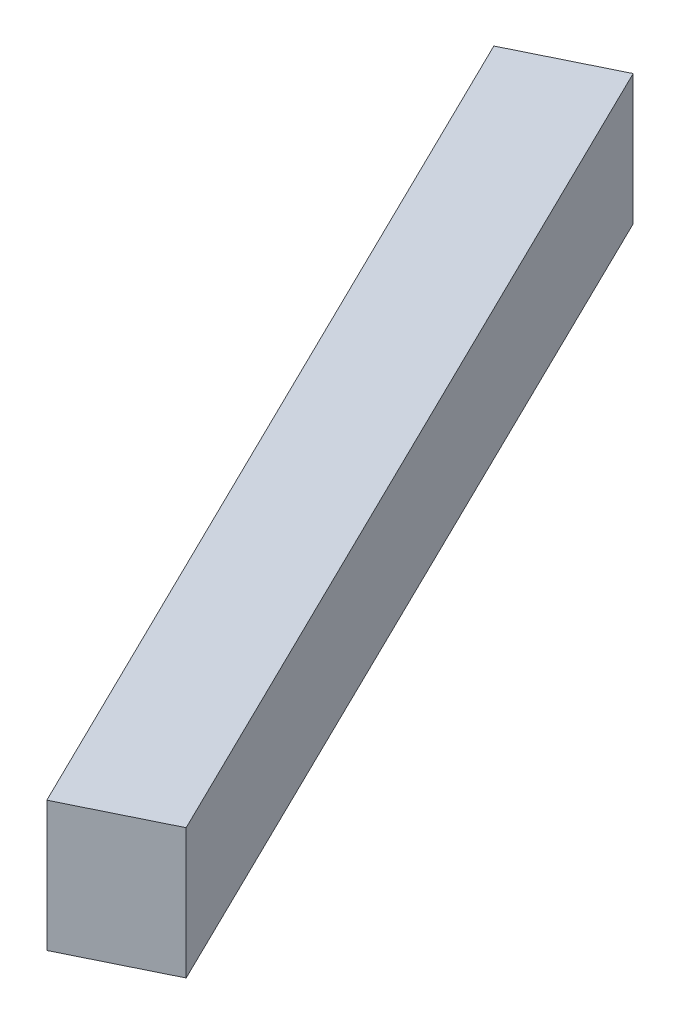
ISO-10303-21;
HEADER;
FILE_DESCRIPTION(('STEP AP214'),'2;1');
FILE_NAME('part.step','',(''),(''),'','','');
FILE_SCHEMA(('AUTOMOTIVE_DESIGN { 1 0 10303 214 1 1 1 1 }'));
ENDSEC;
DATA;
#1=APPLICATION_CONTEXT('core data for automotive mechanical design processes');
#2=APPLICATION_PROTOCOL_DEFINITION('international standard','automotive_design',2000,#1);
#3=PRODUCT_CONTEXT('',#1,'mechanical');
#4=PRODUCT('Part','Part','',(#3));
#5=PRODUCT_RELATED_PRODUCT_CATEGORY('part','',(#4));
#6=PRODUCT_DEFINITION_FORMATION('','',#4);
#7=PRODUCT_DEFINITION_CONTEXT('part definition',#1,'design');
#8=PRODUCT_DEFINITION('design','',#6,#7);
#9=PRODUCT_DEFINITION_SHAPE('','',#8);
#10=(LENGTH_UNIT() NAMED_UNIT(*) SI_UNIT(.MILLI.,.METRE.));
#11=(NAMED_UNIT(*) PLANE_ANGLE_UNIT() SI_UNIT($,.RADIAN.));
#12=(NAMED_UNIT(*) SI_UNIT($,.STERADIAN.) SOLID_ANGLE_UNIT());
#13=UNCERTAINTY_MEASURE_WITH_UNIT(LENGTH_MEASURE(1.E-05),#10,'distance_accuracy_value','');
#14=(GEOMETRIC_REPRESENTATION_CONTEXT(3) GLOBAL_UNCERTAINTY_ASSIGNED_CONTEXT((#13)) GLOBAL_UNIT_ASSIGNED_CONTEXT((#10,
#11,#12)) REPRESENTATION_CONTEXT('',''));
#15=CARTESIAN_POINT('',(0.,0.,0.));
#16=DIRECTION('',(0.,0.,1.));
#17=DIRECTION('',(1.,0.,0.));
#18=AXIS2_PLACEMENT_3D('',#15,#16,#17);
#19=CARTESIAN_POINT('',(-8.00969691536808,7.874,-16.1162711228147));
#20=DIRECTION('',(0.89796613991064,0.,-0.440064553871345));
#21=DIRECTION('',(-0.440064553871345,0.,-0.89796613991064));
#22=AXIS2_PLACEMENT_3D('',#19,#20,#21);
#23=PLANE('',#22);
#24=DIRECTION('',(0.,1.,0.));
#25=VECTOR('',#24,1.);
#26=CARTESIAN_POINT('',(-8.00969691536808,7.874,-16.1162711228147));
#27=LINE('',#26,#25);
#28=CARTESIAN_POINT('',(-8.00969691536808,7.62,-16.1162711228147));
#29=VERTEX_POINT('',#28);
#30=CARTESIAN_POINT('',(-8.00969691536808,7.874,-16.1162711228147));
#31=VERTEX_POINT('',#30);
#32=EDGE_CURVE('E20',#29,#31,#27,.T.);
#33=ORIENTED_EDGE('',*,*,#32,.T.);
#34=DIRECTION('',(-0.440064553871358,0.,-0.897966139910633));
#35=VECTOR('',#34,1.);
#36=CARTESIAN_POINT('',(-8.00969691536808,7.874,-16.1162711228147));
#37=LINE('',#36,#35);
#38=CARTESIAN_POINT('',(-8.84801989049298,7.874,-17.8268966193444));
#39=VERTEX_POINT('',#38);
#40=EDGE_CURVE('E55',#31,#39,#37,.T.);
#41=ORIENTED_EDGE('',*,*,#40,.T.);
#42=DIRECTION('',(0.,1.,0.));
#43=VECTOR('',#42,1.);
#44=CARTESIAN_POINT('',(-8.84801989049299,7.874,-17.8268966193444));
#45=LINE('',#44,#43);
#46=CARTESIAN_POINT('',(-8.84801989049298,7.62,-17.8268966193444));
#47=VERTEX_POINT('',#46);
#48=EDGE_CURVE('E76',#39,#47,#45,.F.);
#49=ORIENTED_EDGE('',*,*,#48,.T.);
#50=DIRECTION('',(-0.440064553871358,0.,-0.897966139910633));
#51=VECTOR('',#50,1.);
#52=CARTESIAN_POINT('',(-8.00969691536808,7.62,-16.1162711228147));
#53=LINE('',#52,#51);
#54=EDGE_CURVE('E58',#29,#47,#53,.T.);
#55=ORIENTED_EDGE('',*,*,#54,.F.);
#56=EDGE_LOOP('',(#33,#41,#49,#55));
#57=FACE_BOUND('',#56,.T.);
#58=ADVANCED_FACE('F17',(#57),#23,.F.);
#59=CARTESIAN_POINT('',(-8.00969691536808,7.874,-16.1162711228147));
#60=DIRECTION('',(-0.440064553871331,0.,-0.897966139910646));
#61=DIRECTION('',(-0.897966139910646,0.,0.440064553871331));
#62=AXIS2_PLACEMENT_3D('',#59,#60,#61);
#63=PLANE('',#62);
#64=DIRECTION('',(0.,1.,0.));
#65=VECTOR('',#64,1.);
#66=CARTESIAN_POINT('',(-7.82723019573824,7.874,-16.2056922401613));
#67=LINE('',#66,#65);
#68=CARTESIAN_POINT('',(-7.82723019573825,7.62,-16.2056922401613));
#69=VERTEX_POINT('',#68);
#70=CARTESIAN_POINT('',(-7.82723019573825,7.874,-16.2056922401613));
#71=VERTEX_POINT('',#70);
#72=EDGE_CURVE('E73',#69,#71,#67,.T.);
#73=ORIENTED_EDGE('',*,*,#72,.T.);
#74=DIRECTION('',(-0.897966139910747,0.,0.440064553871124));
#75=VECTOR('',#74,1.);
#76=CARTESIAN_POINT('',(-7.82723019573824,7.874,-16.2056922401613));
#77=LINE('',#76,#75);
#78=EDGE_CURVE('E63',#71,#31,#77,.T.);
#79=ORIENTED_EDGE('',*,*,#78,.T.);
#80=ORIENTED_EDGE('',*,*,#32,.F.);
#81=DIRECTION('',(-0.897966139910747,0.,0.440064553871124));
#82=VECTOR('',#81,1.);
#83=CARTESIAN_POINT('',(-7.82723019573824,7.62,-16.2056922401613));
#84=LINE('',#83,#82);
#85=EDGE_CURVE('E80',#69,#29,#84,.T.);
#86=ORIENTED_EDGE('',*,*,#85,.F.);
#87=EDGE_LOOP('',(#73,#79,#80,#86));
#88=FACE_BOUND('',#87,.T.);
#89=ADVANCED_FACE('F72',(#88),#63,.F.);
#90=CARTESIAN_POINT('',(-8.00969691536808,7.874,-16.1162711228147));
#91=DIRECTION('',(0.,-1.,0.));
#92=DIRECTION('',(0.,0.,-1.));
#93=AXIS2_PLACEMENT_3D('',#90,#91,#92);
#94=PLANE('',#93);
#95=ORIENTED_EDGE('',*,*,#78,.F.);
#96=DIRECTION('',(0.440064553871658,0.,0.897966139910486));
#97=VECTOR('',#96,1.);
#98=CARTESIAN_POINT('',(-7.82723019573824,7.874,-16.2056922401613));
#99=LINE('',#98,#97);
#100=CARTESIAN_POINT('',(-8.66555317099996,7.874,-17.9163177369687));
#101=VERTEX_POINT('',#100);
#102=EDGE_CURVE('E83',#71,#101,#99,.F.);
#103=ORIENTED_EDGE('',*,*,#102,.T.);
#104=DIRECTION('',(0.897966139240311,0.,-0.440064555239173));
#105=VECTOR('',#104,1.);
#106=CARTESIAN_POINT('',(-8.84801989049299,7.874,-17.8268966193444));
#107=LINE('',#106,#105);
#108=EDGE_CURVE('E69',#101,#39,#107,.F.);
#109=ORIENTED_EDGE('',*,*,#108,.T.);
#110=ORIENTED_EDGE('',*,*,#40,.F.);
#111=EDGE_LOOP('',(#95,#103,#109,#110));
#112=FACE_BOUND('',#111,.T.);
#113=ADVANCED_FACE('F66',(#112),#94,.F.);
#114=CARTESIAN_POINT('',(-8.84801989049299,7.874,-17.8268966193444));
#115=DIRECTION('',(0.440064555239173,0.,0.897966139240311));
#116=DIRECTION('',(0.897966139240311,0.,-0.440064555239173));
#117=AXIS2_PLACEMENT_3D('',#114,#115,#116);
#118=PLANE('',#117);
#119=ORIENTED_EDGE('',*,*,#48,.F.);
#120=ORIENTED_EDGE('',*,*,#108,.F.);
#121=DIRECTION('',(0.,1.,0.));
#122=VECTOR('',#121,1.);
#123=CARTESIAN_POINT('',(-8.66555317099995,7.874,-17.9163177369687));
#124=LINE('',#123,#122);
#125=CARTESIAN_POINT('',(-8.66555317099996,7.62,-17.9163177369687));
#126=VERTEX_POINT('',#125);
#127=EDGE_CURVE('E26',#101,#126,#124,.F.);
#128=ORIENTED_EDGE('',*,*,#127,.T.);
#129=DIRECTION('',(0.897966139240318,0.,-0.440064555239159));
#130=VECTOR('',#129,1.);
#131=CARTESIAN_POINT('',(-8.84801989049299,7.62,-17.8268966193444));
#132=LINE('',#131,#130);
#133=EDGE_CURVE('E34',#47,#126,#132,.T.);
#134=ORIENTED_EDGE('',*,*,#133,.F.);
#135=EDGE_LOOP('',(#119,#120,#128,#134));
#136=FACE_BOUND('',#135,.T.);
#137=ADVANCED_FACE('F88',(#136),#118,.F.);
#138=CARTESIAN_POINT('',(-8.00969691536808,7.62,-16.1162711228147));
#139=DIRECTION('',(0.,-1.,0.));
#140=DIRECTION('',(0.,0.,-1.));
#141=AXIS2_PLACEMENT_3D('',#138,#139,#140);
#142=PLANE('',#141);
#143=DIRECTION('',(0.440064553871658,0.,0.897966139910486));
#144=VECTOR('',#143,1.);
#145=CARTESIAN_POINT('',(-7.82723019573824,7.62,-16.2056922401613));
#146=LINE('',#145,#144);
#147=EDGE_CURVE('E11',#126,#69,#146,.T.);
#148=ORIENTED_EDGE('',*,*,#147,.T.);
#149=ORIENTED_EDGE('',*,*,#85,.T.);
#150=ORIENTED_EDGE('',*,*,#54,.T.);
#151=ORIENTED_EDGE('',*,*,#133,.T.);
#152=EDGE_LOOP('',(#148,#149,#150,#151));
#153=FACE_BOUND('',#152,.T.);
#154=ADVANCED_FACE('F91',(#153),#142,.T.);
#155=CARTESIAN_POINT('',(-7.82723019573824,7.874,-16.2056922401613));
#156=DIRECTION('',(-0.897966139910486,0.,0.440064553871658));
#157=DIRECTION('',(0.440064553871658,0.,0.897966139910486));
#158=AXIS2_PLACEMENT_3D('',#155,#156,#157);
#159=PLANE('',#158);
#160=ORIENTED_EDGE('',*,*,#127,.F.);
#161=ORIENTED_EDGE('',*,*,#102,.F.);
#162=ORIENTED_EDGE('',*,*,#72,.F.);
#163=ORIENTED_EDGE('',*,*,#147,.F.);
#164=EDGE_LOOP('',(#160,#161,#162,#163));
#165=FACE_BOUND('',#164,.T.);
#166=ADVANCED_FACE('F90',(#165),#159,.F.);
#167=CLOSED_SHELL('',(#58,#89,#113,#137,#154,#166));
#168=MANIFOLD_SOLID_BREP('B1',#167);
#169=ADVANCED_BREP_SHAPE_REPRESENTATION('',(#18,#168),#14);
#170=SHAPE_DEFINITION_REPRESENTATION(#9,#169);
ENDSEC;
END-ISO-10303-21;
